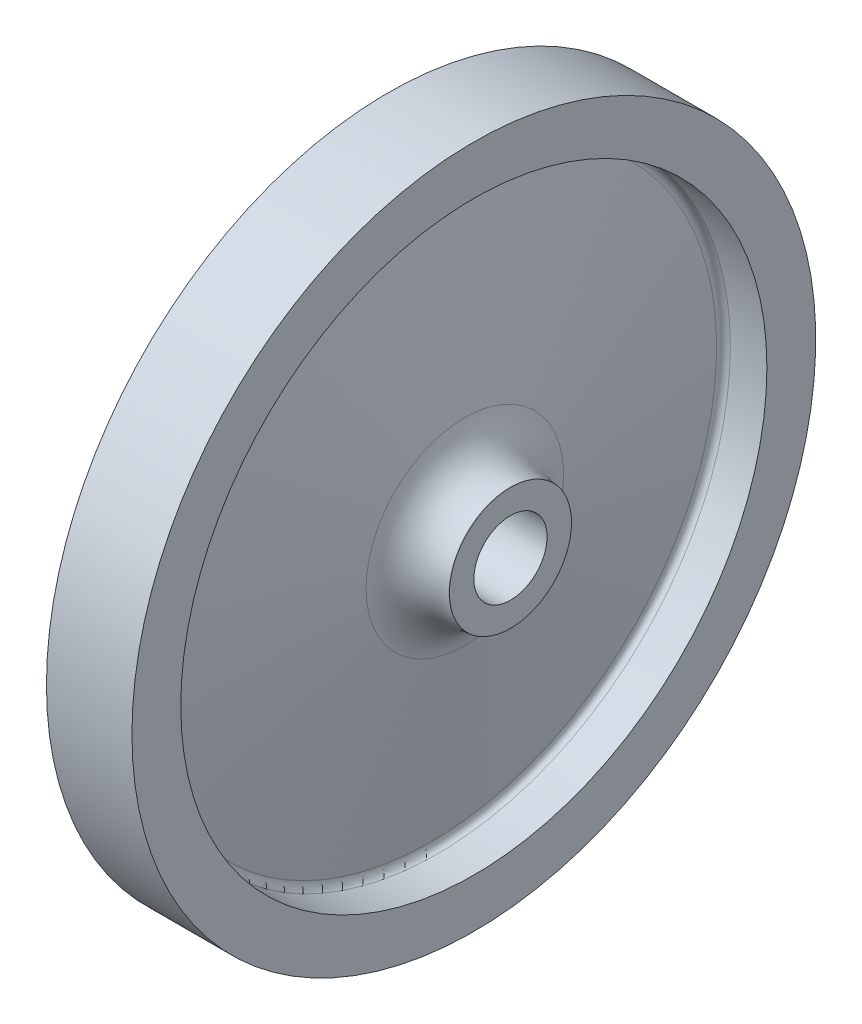
ISO-10303-21;
HEADER;
FILE_DESCRIPTION(('STEP AP214'),'2;1');
FILE_NAME('part.step','',(''),(''),'','','');
FILE_SCHEMA(('AUTOMOTIVE_DESIGN { 1 0 10303 214 1 1 1 1 }'));
ENDSEC;
DATA;
#1=APPLICATION_CONTEXT('core data for automotive mechanical design processes');
#2=APPLICATION_PROTOCOL_DEFINITION('international standard','automotive_design',2000,#1);
#3=PRODUCT_CONTEXT('',#1,'mechanical');
#4=PRODUCT('Part','Part','',(#3));
#5=PRODUCT_RELATED_PRODUCT_CATEGORY('part','',(#4));
#6=PRODUCT_DEFINITION_FORMATION('','',#4);
#7=PRODUCT_DEFINITION_CONTEXT('part definition',#1,'design');
#8=PRODUCT_DEFINITION('design','',#6,#7);
#9=PRODUCT_DEFINITION_SHAPE('','',#8);
#10=(LENGTH_UNIT() NAMED_UNIT(*) SI_UNIT(.MILLI.,.METRE.));
#11=(NAMED_UNIT(*) PLANE_ANGLE_UNIT() SI_UNIT($,.RADIAN.));
#12=(NAMED_UNIT(*) SI_UNIT($,.STERADIAN.) SOLID_ANGLE_UNIT());
#13=UNCERTAINTY_MEASURE_WITH_UNIT(LENGTH_MEASURE(1.E-05),#10,'distance_accuracy_value','');
#14=(GEOMETRIC_REPRESENTATION_CONTEXT(3) GLOBAL_UNCERTAINTY_ASSIGNED_CONTEXT((#13)) GLOBAL_UNIT_ASSIGNED_CONTEXT((#10,
#11,#12)) REPRESENTATION_CONTEXT('',''));
#15=CARTESIAN_POINT('',(0.,0.,0.));
#16=DIRECTION('',(0.,0.,1.));
#17=DIRECTION('',(1.,0.,0.));
#18=AXIS2_PLACEMENT_3D('',#15,#16,#17);
#19=CARTESIAN_POINT('',(-24.3191489361702,9.525,0.));
#20=DIRECTION('',(1.,0.,0.));
#21=DIRECTION('',(0.,0.,-1.));
#22=AXIS2_PLACEMENT_3D('',#19,#20,#21);
#23=PLANE('',#22);
#24=CARTESIAN_POINT('',(-24.3191489361702,0.,0.));
#25=DIRECTION('',(-1.,0.,0.));
#26=DIRECTION('',(0.,0.,1.));
#27=AXIS2_PLACEMENT_3D('',#24,#25,#26);
#28=CIRCLE('',#27,9.525);
#29=CARTESIAN_POINT('',(-24.3191489361702,0.,9.525));
#30=VERTEX_POINT('',#29);
#31=EDGE_CURVE('E104',#30,#30,#28,.T.);
#32=ORIENTED_EDGE('',*,*,#31,.F.);
#33=EDGE_LOOP('',(#32));
#34=FACE_BOUND('',#33,.T.);
#35=CARTESIAN_POINT('',(-24.3191489361702,0.,0.));
#36=DIRECTION('',(-1.,0.,0.));
#37=DIRECTION('',(0.,0.,1.));
#38=AXIS2_PLACEMENT_3D('',#35,#36,#37);
#39=CIRCLE('',#38,15.875);
#40=CARTESIAN_POINT('',(-24.3191489361702,0.,15.875));
#41=VERTEX_POINT('',#40);
#42=EDGE_CURVE('E10',#41,#41,#39,.T.);
#43=ORIENTED_EDGE('',*,*,#42,.T.);
#44=EDGE_LOOP('',(#43));
#45=FACE_BOUND('',#44,.T.);
#46=ADVANCED_FACE('F37',(#34,#45),#23,.F.);
#47=CARTESIAN_POINT('',(-25.0284574468085,0.,0.));
#48=DIRECTION('',(-1.,0.,0.));
#49=DIRECTION('',(0.,0.,1.));
#50=AXIS2_PLACEMENT_3D('',#47,#48,#49);
#51=CYLINDRICAL_SURFACE('',#50,15.875);
#52=ORIENTED_EDGE('',*,*,#42,.F.);
#53=EDGE_LOOP('',(#52));
#54=FACE_BOUND('',#53,.T.);
#55=CARTESIAN_POINT('',(-14.1916149483845,0.,0.));
#56=DIRECTION('',(-1.,0.,0.));
#57=DIRECTION('',(0.,0.,1.));
#58=AXIS2_PLACEMENT_3D('',#55,#56,#57);
#59=CIRCLE('',#58,15.875);
#60=CARTESIAN_POINT('',(-14.1916149483845,0.,15.875));
#61=VERTEX_POINT('',#60);
#62=EDGE_CURVE('E44',#61,#61,#59,.T.);
#63=ORIENTED_EDGE('',*,*,#62,.T.);
#64=EDGE_LOOP('',(#63));
#65=FACE_BOUND('',#64,.T.);
#66=ADVANCED_FACE('F112',(#54,#65),#51,.T.);
#67=CARTESIAN_POINT('',(-14.1916149483845,0.,0.));
#68=DIRECTION('',(-1.,0.,0.));
#69=DIRECTION('',(0.,0.,1.));
#70=AXIS2_PLACEMENT_3D('',#67,#68,#69);
#71=TOROIDAL_SURFACE('',#70,18.415,2.54);
#72=ORIENTED_EDGE('',*,*,#62,.F.);
#73=EDGE_LOOP('',(#72));
#74=FACE_BOUND('',#73,.T.);
#75=CARTESIAN_POINT('',(-11.6922374925562,0.,0.));
#76=DIRECTION('',(-1.,0.,0.));
#77=DIRECTION('',(0.,0.,1.));
#78=AXIS2_PLACEMENT_3D('',#75,#76,#77);
#79=CIRCLE('',#78,18.8674514706542);
#80=CARTESIAN_POINT('',(-11.6922374925562,0.,18.8674514706542));
#81=VERTEX_POINT('',#80);
#82=EDGE_CURVE('E49',#81,#81,#79,.T.);
#83=ORIENTED_EDGE('',*,*,#82,.T.);
#84=EDGE_LOOP('',(#83));
#85=FACE_BOUND('',#84,.T.);
#86=ADVANCED_FACE('F116',(#74,#85),#71,.F.);
#87=CARTESIAN_POINT('',(-21.8252654103652,0.,0.));
#88=DIRECTION('',(-1.,0.,0.));
#89=DIRECTION('',(0.,0.,1.));
#90=AXIS2_PLACEMENT_3D('',#87,#88,#89);
#91=CONICAL_SURFACE('',#90,74.8430934559252,1.39171008835953);
#92=CARTESIAN_POINT('',(-21.8252654103652,0.,0.));
#93=DIRECTION('',(-1.,0.,0.));
#94=DIRECTION('',(0.,0.,1.));
#95=AXIS2_PLACEMENT_3D('',#92,#93,#94);
#96=CIRCLE('',#95,74.8430934559252);
#97=CARTESIAN_POINT('',(-21.8252654103652,0.,74.8430934559252));
#98=VERTEX_POINT('',#97);
#99=EDGE_CURVE('E54',#98,#98,#96,.T.);
#100=CARTESIAN_POINT('',(-11.6922374925562,0.,18.8674514706542));
#101=CARTESIAN_POINT('',(-11.7977898667001,0.,19.4505310746674));
#102=CARTESIAN_POINT('',(-11.9033422408439,0.,20.0336106786807));
#103=CARTESIAN_POINT('',(-12.1144469891316,0.,21.1997698867072));
#104=CARTESIAN_POINT('',(-12.2199993632754,0.,21.7828494907204));
#105=CARTESIAN_POINT('',(-12.4311041115631,0.,22.9490086987469));
#106=CARTESIAN_POINT('',(-12.536656485707,0.,23.5320883027601));
#107=CARTESIAN_POINT('',(-12.7477612339947,0.,24.6982475107866));
#108=CARTESIAN_POINT('',(-12.8533136081385,0.,25.2813271147999));
#109=CARTESIAN_POINT('',(-13.0644183564262,0.,26.4474863228263));
#110=CARTESIAN_POINT('',(-13.16997073057,0.,27.0305659268396));
#111=CARTESIAN_POINT('',(-13.3810754788577,0.,28.196725134866));
#112=CARTESIAN_POINT('',(-13.4866278530016,0.,28.7798047388793));
#113=CARTESIAN_POINT('',(-13.6977326012893,0.,29.9459639469058));
#114=CARTESIAN_POINT('',(-13.8032849754331,0.,30.529043550919));
#115=CARTESIAN_POINT('',(-14.0143897237208,0.,31.6952027589455));
#116=CARTESIAN_POINT('',(-14.1199420978646,0.,32.2782823629587));
#117=CARTESIAN_POINT('',(-14.3310468461523,0.,33.4444415709852));
#118=CARTESIAN_POINT('',(-14.4365992202962,0.,34.0275211749984));
#119=CARTESIAN_POINT('',(-14.6477039685838,0.,35.1936803830249));
#120=CARTESIAN_POINT('',(-14.7532563427277,0.,35.7767599870382));
#121=CARTESIAN_POINT('',(-14.9643610910154,0.,36.9429191950646));
#122=CARTESIAN_POINT('',(-15.0699134651592,0.,37.5259987990779));
#123=CARTESIAN_POINT('',(-15.2810182134469,0.,38.6921580071044));
#124=CARTESIAN_POINT('',(-15.3865705875907,0.,39.2752376111176));
#125=CARTESIAN_POINT('',(-15.5976753358784,0.,40.4413968191441));
#126=CARTESIAN_POINT('',(-15.7032277100223,0.,41.0244764231573));
#127=CARTESIAN_POINT('',(-15.91433245831,0.,42.1906356311838));
#128=CARTESIAN_POINT('',(-16.0198848324538,0.,42.773715235197));
#129=CARTESIAN_POINT('',(-16.2309895807415,0.,43.9398744432235));
#130=CARTESIAN_POINT('',(-16.3365419548853,0.,44.5229540472368));
#131=CARTESIAN_POINT('',(-16.547646703173,0.,45.6891132552632));
#132=CARTESIAN_POINT('',(-16.6531990773169,0.,46.2721928592765));
#133=CARTESIAN_POINT('',(-16.8643038256046,0.,47.438352067303));
#134=CARTESIAN_POINT('',(-16.9698561997484,0.,48.0214316713162));
#135=CARTESIAN_POINT('',(-17.1809609480361,0.,49.1875908793427));
#136=CARTESIAN_POINT('',(-17.2865133221799,0.,49.7706704833559));
#137=CARTESIAN_POINT('',(-17.4976180704676,0.,50.9368296913824));
#138=CARTESIAN_POINT('',(-17.6031704446115,0.,51.5199092953956));
#139=CARTESIAN_POINT('',(-17.8142751928991,0.,52.6860685034221));
#140=CARTESIAN_POINT('',(-17.919827567043,0.,53.2691481074354));
#141=CARTESIAN_POINT('',(-18.1309323153307,0.,54.4353073154618));
#142=CARTESIAN_POINT('',(-18.2364846894745,0.,55.0183869194751));
#143=CARTESIAN_POINT('',(-18.4475894377622,0.,56.1845461275016));
#144=CARTESIAN_POINT('',(-18.5531418119061,0.,56.7676257315148));
#145=CARTESIAN_POINT('',(-18.7642465601937,0.,57.9337849395413));
#146=CARTESIAN_POINT('',(-18.8697989343376,0.,58.5168645435545));
#147=CARTESIAN_POINT('',(-19.0809036826253,0.,59.683023751581));
#148=CARTESIAN_POINT('',(-19.1864560567691,0.,60.2661033555942));
#149=CARTESIAN_POINT('',(-19.3975608050568,0.,61.4322625636207));
#150=CARTESIAN_POINT('',(-19.5031131792006,0.,62.0153421676339));
#151=CARTESIAN_POINT('',(-19.7142179274883,0.,63.1815013756604));
#152=CARTESIAN_POINT('',(-19.8197703016322,0.,63.7645809796737));
#153=CARTESIAN_POINT('',(-20.0308750499199,0.,64.9307401877002));
#154=CARTESIAN_POINT('',(-20.1364274240637,0.,65.5138197917134));
#155=CARTESIAN_POINT('',(-20.3475321723514,0.,66.6799789997399));
#156=CARTESIAN_POINT('',(-20.4530845464952,0.,67.2630586037531));
#157=CARTESIAN_POINT('',(-20.6641892947829,0.,68.4292178117796));
#158=CARTESIAN_POINT('',(-20.7697416689268,0.,69.0122974157928));
#159=CARTESIAN_POINT('',(-20.9808464172145,0.,70.1784566238193));
#160=CARTESIAN_POINT('',(-21.0863987913583,0.,70.7615362278326));
#161=CARTESIAN_POINT('',(-21.297503539646,0.,71.927695435859));
#162=CARTESIAN_POINT('',(-21.4030559137898,0.,72.5107750398723));
#163=CARTESIAN_POINT('',(-21.6141606620775,0.,73.6769342478987));
#164=CARTESIAN_POINT('',(-21.7197130362214,0.,74.260013851912));
#165=CARTESIAN_POINT('',(-21.8252654103652,0.,74.8430934559252));
#166=B_SPLINE_CURVE_WITH_KNOTS('',3,(#100,#101,#102,#103,#104,#105,#106,#107,#108,#109,#110,
#111,#112,#113,#114,#115,#116,#117,#118,#119,#120,#121,#122,#123,#124,#125,#126,#127,#128,#129,
#130,#131,#132,#133,#134,#135,#136,#137,#138,#139,#140,#141,#142,#143,#144,#145,#146,#147,#148,
#149,#150,#151,#152,#153,#154,#155,#156,#157,#158,#159,#160,#161,#162,#163,#164,#165),
.UNSPECIFIED.,.F.,.F.,(4,2,2,2,2,2,2,2,2,2,2,2,2,2,2,2,2,2,2,2,2,2,2,2,2,2,2,2,2,2,2,2,4),(0.,
1.77766930409814,3.55533860819626,5.33300791229441,7.11067721639254,8.88834652049067,
10.6660158245888,12.4436851286869,14.2213544327851,15.9990237368832,17.7766930409813,
19.5543623450795,21.3320316491776,23.1097009532757,24.8873702573739,26.665039561472,
28.4427088655701,30.2203781696683,31.9980474737664,33.7757167778645,35.5533860819627,
37.3310553860608,39.108724690159,40.8863939942571,42.6640632983552,44.4417326024534,
46.2194019065515,47.9970712106496,49.7747405147478,51.5524098188459,53.3300791229441,
55.1077484270422,56.8854177311403),.UNSPECIFIED.);
#167=EDGE_CURVE('BSEAM121',#81,#98,#166,.T.);
#168=ORIENTED_EDGE('',*,*,#82,.F.);
#169=ORIENTED_EDGE('',*,*,#99,.T.);
#170=ORIENTED_EDGE('',*,*,#167,.T.);
#171=ORIENTED_EDGE('',*,*,#167,.F.);
#172=EDGE_LOOP('',(#168,#170,#169,#171));
#173=FACE_BOUND('',#172,.T.);
#174=ADVANCED_FACE('F121',(#173),#91,.F.);
#175=CARTESIAN_POINT('',(-23.4498607566536,0.,0.));
#176=DIRECTION('',(-1.,0.,0.));
#177=DIRECTION('',(0.,0.,1.));
#178=AXIS2_PLACEMENT_3D('',#175,#176,#177);
#179=TOROIDAL_SURFACE('',#178,74.549,1.65100000000001);
#180=ORIENTED_EDGE('',*,*,#99,.F.);
#181=EDGE_LOOP('',(#180));
#182=FACE_BOUND('',#181,.T.);
#183=CARTESIAN_POINT('',(-23.4498607566536,0.,0.));
#184=DIRECTION('',(-1.,0.,0.));
#185=DIRECTION('',(0.,0.,1.));
#186=AXIS2_PLACEMENT_3D('',#183,#184,#185);
#187=CIRCLE('',#186,76.2);
#188=CARTESIAN_POINT('',(-23.4498607566536,0.,76.2));
#189=VERTEX_POINT('',#188);
#190=EDGE_CURVE('E60',#189,#189,#187,.T.);
#191=ORIENTED_EDGE('',*,*,#190,.T.);
#192=EDGE_LOOP('',(#191));
#193=FACE_BOUND('',#192,.T.);
#194=ADVANCED_FACE('F127',(#182,#193),#179,.F.);
#195=CARTESIAN_POINT('',(-25.0284574468085,0.,0.));
#196=DIRECTION('',(-1.,0.,0.));
#197=DIRECTION('',(0.,0.,1.));
#198=AXIS2_PLACEMENT_3D('',#195,#196,#197);
#199=CYLINDRICAL_SURFACE('',#198,76.2);
#200=ORIENTED_EDGE('',*,*,#190,.F.);
#201=EDGE_LOOP('',(#200));
#202=FACE_BOUND('',#201,.T.);
#203=CARTESIAN_POINT('',(-24.3191489361702,0.,0.));
#204=DIRECTION('',(-1.,0.,0.));
#205=DIRECTION('',(0.,0.,1.));
#206=AXIS2_PLACEMENT_3D('',#203,#204,#205);
#207=CIRCLE('',#206,76.2);
#208=CARTESIAN_POINT('',(-24.3191489361702,0.,76.2));
#209=VERTEX_POINT('',#208);
#210=EDGE_CURVE('E64',#209,#209,#207,.T.);
#211=ORIENTED_EDGE('',*,*,#210,.T.);
#212=EDGE_LOOP('',(#211));
#213=FACE_BOUND('',#212,.T.);
#214=ADVANCED_FACE('F131',(#202,#213),#199,.F.);
#215=CARTESIAN_POINT('',(-24.3191489361702,88.9,0.));
#216=DIRECTION('',(1.,0.,0.));
#217=DIRECTION('',(0.,0.,-1.));
#218=AXIS2_PLACEMENT_3D('',#215,#216,#217);
#219=PLANE('',#218);
#220=ORIENTED_EDGE('',*,*,#210,.F.);
#221=EDGE_LOOP('',(#220));
#222=FACE_BOUND('',#221,.T.);
#223=CARTESIAN_POINT('',(-24.3191489361702,0.,0.));
#224=DIRECTION('',(-1.,0.,0.));
#225=DIRECTION('',(0.,0.,1.));
#226=AXIS2_PLACEMENT_3D('',#223,#224,#225);
#227=CIRCLE('',#226,88.9);
#228=CARTESIAN_POINT('',(-24.3191489361702,0.,88.9));
#229=VERTEX_POINT('',#228);
#230=EDGE_CURVE('E68',#229,#229,#227,.T.);
#231=ORIENTED_EDGE('',*,*,#230,.T.);
#232=EDGE_LOOP('',(#231));
#233=FACE_BOUND('',#232,.T.);
#234=ADVANCED_FACE('F135',(#222,#233),#219,.F.);
#235=CARTESIAN_POINT('',(-25.0284574468085,0.,0.));
#236=DIRECTION('',(-1.,0.,0.));
#237=DIRECTION('',(0.,0.,1.));
#238=AXIS2_PLACEMENT_3D('',#235,#236,#237);
#239=CYLINDRICAL_SURFACE('',#238,88.9);
#240=ORIENTED_EDGE('',*,*,#230,.F.);
#241=EDGE_LOOP('',(#240));
#242=FACE_BOUND('',#241,.T.);
#243=CARTESIAN_POINT('',(-2.09414893617021,0.,0.));
#244=DIRECTION('',(-1.,0.,0.));
#245=DIRECTION('',(0.,0.,1.));
#246=AXIS2_PLACEMENT_3D('',#243,#244,#245);
#247=CIRCLE('',#246,88.9);
#248=CARTESIAN_POINT('',(-2.09414893617021,0.,88.9));
#249=VERTEX_POINT('',#248);
#250=EDGE_CURVE('E72',#249,#249,#247,.T.);
#251=ORIENTED_EDGE('',*,*,#250,.T.);
#252=EDGE_LOOP('',(#251));
#253=FACE_BOUND('',#252,.T.);
#254=ADVANCED_FACE('F139',(#242,#253),#239,.T.);
#255=CARTESIAN_POINT('',(-2.09414893617021,88.9,0.));
#256=DIRECTION('',(-1.,0.,0.));
#257=DIRECTION('',(0.,0.,1.));
#258=AXIS2_PLACEMENT_3D('',#255,#256,#257);
#259=PLANE('',#258);
#260=ORIENTED_EDGE('',*,*,#250,.F.);
#261=EDGE_LOOP('',(#260));
#262=FACE_BOUND('',#261,.T.);
#263=CARTESIAN_POINT('',(-2.09414893617021,0.,0.));
#264=DIRECTION('',(-1.,0.,0.));
#265=DIRECTION('',(0.,0.,1.));
#266=AXIS2_PLACEMENT_3D('',#263,#264,#265);
#267=CIRCLE('',#266,76.2);
#268=CARTESIAN_POINT('',(-2.09414893617021,0.,76.2));
#269=VERTEX_POINT('',#268);
#270=EDGE_CURVE('E76',#269,#269,#267,.T.);
#271=ORIENTED_EDGE('',*,*,#270,.T.);
#272=EDGE_LOOP('',(#271));
#273=FACE_BOUND('',#272,.T.);
#274=ADVANCED_FACE('F143',(#262,#273),#259,.F.);
#275=CARTESIAN_POINT('',(-25.0284574468085,0.,0.));
#276=DIRECTION('',(-1.,0.,0.));
#277=DIRECTION('',(0.,0.,1.));
#278=AXIS2_PLACEMENT_3D('',#275,#276,#277);
#279=CYLINDRICAL_SURFACE('',#278,76.2);
#280=ORIENTED_EDGE('',*,*,#270,.F.);
#281=EDGE_LOOP('',(#280));
#282=FACE_BOUND('',#281,.T.);
#283=CARTESIAN_POINT('',(-11.5982087497442,0.,0.));
#284=DIRECTION('',(-1.,0.,0.));
#285=DIRECTION('',(0.,0.,1.));
#286=AXIS2_PLACEMENT_3D('',#283,#284,#285);
#287=CIRCLE('',#286,76.2);
#288=CARTESIAN_POINT('',(-11.5982087497442,0.,76.2));
#289=VERTEX_POINT('',#288);
#290=EDGE_CURVE('E80',#289,#289,#287,.T.);
#291=ORIENTED_EDGE('',*,*,#290,.T.);
#292=EDGE_LOOP('',(#291));
#293=FACE_BOUND('',#292,.T.);
#294=ADVANCED_FACE('F147',(#282,#293),#279,.F.);
#295=CARTESIAN_POINT('',(-11.5982087497442,0.,0.));
#296=DIRECTION('',(-1.,0.,0.));
#297=DIRECTION('',(0.,0.,1.));
#298=AXIS2_PLACEMENT_3D('',#295,#296,#297);
#299=TOROIDAL_SURFACE('',#298,74.549,1.651);
#300=ORIENTED_EDGE('',*,*,#290,.F.);
#301=EDGE_LOOP('',(#300));
#302=FACE_BOUND('',#301,.T.);
#303=CARTESIAN_POINT('',(-13.2228040960326,0.,0.));
#304=DIRECTION('',(-1.,0.,0.));
#305=DIRECTION('',(0.,0.,1.));
#306=AXIS2_PLACEMENT_3D('',#303,#304,#305);
#307=CIRCLE('',#306,74.2549065440747);
#308=CARTESIAN_POINT('',(-13.2228040960326,0.,74.2549065440747));
#309=VERTEX_POINT('',#308);
#310=EDGE_CURVE('E84',#309,#309,#307,.T.);
#311=ORIENTED_EDGE('',*,*,#310,.T.);
#312=EDGE_LOOP('',(#311));
#313=FACE_BOUND('',#312,.T.);
#314=ADVANCED_FACE('F151',(#302,#313),#299,.F.);
#315=CARTESIAN_POINT('',(-4.43067194684224,0.,0.));
#316=DIRECTION('',(-1.,0.,0.));
#317=DIRECTION('',(0.,0.,1.));
#318=AXIS2_PLACEMENT_3D('',#315,#316,#317);
#319=CONICAL_SURFACE('',#318,25.6864780879251,1.39171008835953);
#320=ORIENTED_EDGE('',*,*,#310,.F.);
#321=EDGE_LOOP('',(#320));
#322=FACE_BOUND('',#321,.T.);
#323=CARTESIAN_POINT('',(-4.43067194684224,0.,0.));
#324=DIRECTION('',(-1.,0.,0.));
#325=DIRECTION('',(0.,0.,1.));
#326=AXIS2_PLACEMENT_3D('',#323,#324,#325);
#327=CIRCLE('',#326,25.6864780879251);
#328=CARTESIAN_POINT('',(-4.43067194684224,0.,25.6864780879251));
#329=VERTEX_POINT('',#328);
#330=EDGE_CURVE('E88',#329,#329,#327,.T.);
#331=ORIENTED_EDGE('',*,*,#330,.T.);
#332=EDGE_LOOP('',(#331));
#333=FACE_BOUND('',#332,.T.);
#334=ADVANCED_FACE('F155',(#322,#333),#319,.T.);
#335=CARTESIAN_POINT('',(7.31640209555084,0.,0.));
#336=DIRECTION('',(-1.,0.,0.));
#337=DIRECTION('',(0.,0.,1.));
#338=AXIS2_PLACEMENT_3D('',#335,#336,#337);
#339=TOROIDAL_SURFACE('',#338,27.813,11.938);
#340=ORIENTED_EDGE('',*,*,#330,.F.);
#341=EDGE_LOOP('',(#340));
#342=FACE_BOUND('',#341,.T.);
#343=CARTESIAN_POINT('',(7.31640209555091,0.,0.));
#344=DIRECTION('',(-1.,0.,0.));
#345=DIRECTION('',(0.,0.,1.));
#346=AXIS2_PLACEMENT_3D('',#343,#344,#345);
#347=CIRCLE('',#346,15.875);
#348=CARTESIAN_POINT('',(7.31640209555091,0.,15.875));
#349=VERTEX_POINT('',#348);
#350=EDGE_CURVE('E92',#349,#349,#347,.T.);
#351=ORIENTED_EDGE('',*,*,#350,.T.);
#352=EDGE_LOOP('',(#351));
#353=FACE_BOUND('',#352,.T.);
#354=ADVANCED_FACE('F159',(#342,#353),#339,.F.);
#355=CARTESIAN_POINT('',(-25.0284574468085,0.,0.));
#356=DIRECTION('',(-1.,0.,0.));
#357=DIRECTION('',(0.,0.,1.));
#358=AXIS2_PLACEMENT_3D('',#355,#356,#357);
#359=CYLINDRICAL_SURFACE('',#358,15.875);
#360=ORIENTED_EDGE('',*,*,#350,.F.);
#361=EDGE_LOOP('',(#360));
#362=FACE_BOUND('',#361,.T.);
#363=CARTESIAN_POINT('',(7.43085106382978,0.,0.));
#364=DIRECTION('',(-1.,0.,0.));
#365=DIRECTION('',(0.,0.,1.));
#366=AXIS2_PLACEMENT_3D('',#363,#364,#365);
#367=CIRCLE('',#366,15.875);
#368=CARTESIAN_POINT('',(7.43085106382978,0.,15.875));
#369=VERTEX_POINT('',#368);
#370=EDGE_CURVE('E96',#369,#369,#367,.T.);
#371=ORIENTED_EDGE('',*,*,#370,.T.);
#372=EDGE_LOOP('',(#371));
#373=FACE_BOUND('',#372,.T.);
#374=ADVANCED_FACE('F163',(#362,#373),#359,.T.);
#375=CARTESIAN_POINT('',(7.43085106382979,15.875,0.));
#376=DIRECTION('',(-1.,0.,0.));
#377=DIRECTION('',(0.,0.,1.));
#378=AXIS2_PLACEMENT_3D('',#375,#376,#377);
#379=PLANE('',#378);
#380=ORIENTED_EDGE('',*,*,#370,.F.);
#381=EDGE_LOOP('',(#380));
#382=FACE_BOUND('',#381,.T.);
#383=CARTESIAN_POINT('',(7.43085106382978,0.,0.));
#384=DIRECTION('',(-1.,0.,0.));
#385=DIRECTION('',(0.,0.,1.));
#386=AXIS2_PLACEMENT_3D('',#383,#384,#385);
#387=CIRCLE('',#386,9.525);
#388=CARTESIAN_POINT('',(7.43085106382978,0.,9.525));
#389=VERTEX_POINT('',#388);
#390=EDGE_CURVE('E100',#389,#389,#387,.T.);
#391=ORIENTED_EDGE('',*,*,#390,.T.);
#392=EDGE_LOOP('',(#391));
#393=FACE_BOUND('',#392,.T.);
#394=ADVANCED_FACE('F167',(#382,#393),#379,.F.);
#395=CARTESIAN_POINT('',(-25.0284574468085,0.,0.));
#396=DIRECTION('',(-1.,0.,0.));
#397=DIRECTION('',(0.,0.,1.));
#398=AXIS2_PLACEMENT_3D('',#395,#396,#397);
#399=CYLINDRICAL_SURFACE('',#398,9.525);
#400=ORIENTED_EDGE('',*,*,#390,.F.);
#401=EDGE_LOOP('',(#400));
#402=FACE_BOUND('',#401,.T.);
#403=ORIENTED_EDGE('',*,*,#31,.T.);
#404=EDGE_LOOP('',(#403));
#405=FACE_BOUND('',#404,.T.);
#406=ADVANCED_FACE('F109',(#402,#405),#399,.F.);
#407=CLOSED_SHELL('',(#46,#66,#86,#174,#194,#214,#234,#254,#274,#294,#314,#334,#354,#374,#394,#406));
#408=MANIFOLD_SOLID_BREP('B2',#407);
#409=ADVANCED_BREP_SHAPE_REPRESENTATION('',(#18,#408),#14);
#410=SHAPE_DEFINITION_REPRESENTATION(#9,#409);
ENDSEC;
END-ISO-10303-21;
